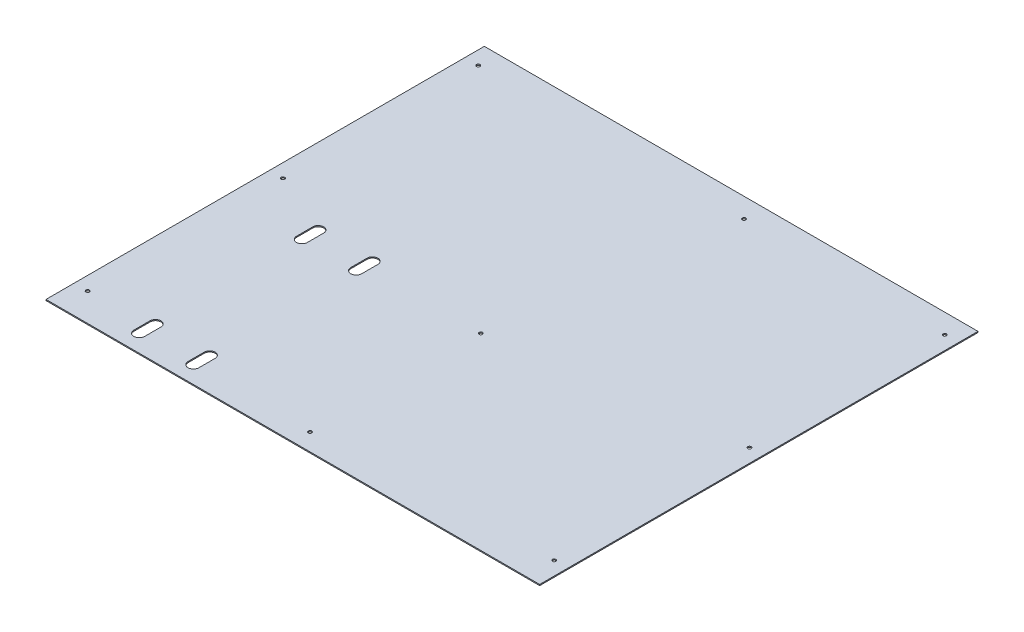
ISO-10303-21;
HEADER;
FILE_DESCRIPTION(('STEP AP214'),'2;1');
FILE_NAME('part.step','',(''),(''),'','','');
FILE_SCHEMA(('AUTOMOTIVE_DESIGN { 1 0 10303 214 1 1 1 1 }'));
ENDSEC;
DATA;
#1=APPLICATION_CONTEXT('core data for automotive mechanical design processes');
#2=APPLICATION_PROTOCOL_DEFINITION('international standard','automotive_design',2000,#1);
#3=PRODUCT_CONTEXT('',#1,'mechanical');
#4=PRODUCT('Part','Part','',(#3));
#5=PRODUCT_RELATED_PRODUCT_CATEGORY('part','',(#4));
#6=PRODUCT_DEFINITION_FORMATION('','',#4);
#7=PRODUCT_DEFINITION_CONTEXT('part definition',#1,'design');
#8=PRODUCT_DEFINITION('design','',#6,#7);
#9=PRODUCT_DEFINITION_SHAPE('','',#8);
#10=(LENGTH_UNIT() NAMED_UNIT(*) SI_UNIT(.MILLI.,.METRE.));
#11=(NAMED_UNIT(*) PLANE_ANGLE_UNIT() SI_UNIT($,.RADIAN.));
#12=(NAMED_UNIT(*) SI_UNIT($,.STERADIAN.) SOLID_ANGLE_UNIT());
#13=UNCERTAINTY_MEASURE_WITH_UNIT(LENGTH_MEASURE(1.E-05),#10,'distance_accuracy_value','');
#14=(GEOMETRIC_REPRESENTATION_CONTEXT(3) GLOBAL_UNCERTAINTY_ASSIGNED_CONTEXT((#13)) GLOBAL_UNIT_ASSIGNED_CONTEXT((#10,
#11,#12)) REPRESENTATION_CONTEXT('',''));
#15=CARTESIAN_POINT('',(0.,0.,0.));
#16=DIRECTION('',(0.,0.,1.));
#17=DIRECTION('',(1.,0.,0.));
#18=AXIS2_PLACEMENT_3D('',#15,#16,#17);
#19=CARTESIAN_POINT('',(227.5,1.,204.5));
#20=DIRECTION('',(-1.,0.,0.));
#21=DIRECTION('',(0.,0.,1.));
#22=AXIS2_PLACEMENT_3D('',#19,#20,#21);
#23=PLANE('',#22);
#24=DIRECTION('',(0.,0.,-1.));
#25=VECTOR('',#24,1.);
#26=CARTESIAN_POINT('',(227.5,0.,204.5));
#27=LINE('',#26,#25);
#28=CARTESIAN_POINT('',(227.5,0.,204.5));
#29=VERTEX_POINT('',#28);
#30=CARTESIAN_POINT('',(227.5,0.,-199.5));
#31=VERTEX_POINT('',#30);
#32=EDGE_CURVE('E405',#29,#31,#27,.T.);
#33=ORIENTED_EDGE('',*,*,#32,.T.);
#34=DIRECTION('',(0.,-1.,0.));
#35=VECTOR('',#34,1.);
#36=CARTESIAN_POINT('',(227.5,1.,-199.5));
#37=LINE('',#36,#35);
#38=CARTESIAN_POINT('',(227.5,1.,-199.5));
#39=VERTEX_POINT('',#38);
#40=EDGE_CURVE('E438',#39,#31,#37,.T.);
#41=ORIENTED_EDGE('',*,*,#40,.F.);
#42=DIRECTION('',(0.,0.,-1.));
#43=VECTOR('',#42,1.);
#44=CARTESIAN_POINT('',(227.5,1.,204.5));
#45=LINE('',#44,#43);
#46=CARTESIAN_POINT('',(227.5,1.,204.5));
#47=VERTEX_POINT('',#46);
#48=EDGE_CURVE('E406',#47,#39,#45,.T.);
#49=ORIENTED_EDGE('',*,*,#48,.F.);
#50=DIRECTION('',(0.,-1.,0.));
#51=VECTOR('',#50,1.);
#52=CARTESIAN_POINT('',(227.5,1.,204.5));
#53=LINE('',#52,#51);
#54=EDGE_CURVE('E418',#47,#29,#53,.T.);
#55=ORIENTED_EDGE('',*,*,#54,.T.);
#56=EDGE_LOOP('',(#33,#41,#49,#55));
#57=FACE_BOUND('',#56,.T.);
#58=ADVANCED_FACE('F40',(#57),#23,.F.);
#59=CARTESIAN_POINT('',(-227.5,1.,-199.5));
#60=DIRECTION('',(0.,0.,1.));
#61=DIRECTION('',(1.,0.,0.));
#62=AXIS2_PLACEMENT_3D('',#59,#60,#61);
#63=PLANE('',#62);
#64=DIRECTION('',(-1.,0.,0.));
#65=VECTOR('',#64,1.);
#66=CARTESIAN_POINT('',(-227.5,0.,-199.5));
#67=LINE('',#66,#65);
#68=CARTESIAN_POINT('',(-227.5,0.,-199.5));
#69=VERTEX_POINT('',#68);
#70=EDGE_CURVE('E422',#31,#69,#67,.T.);
#71=ORIENTED_EDGE('',*,*,#70,.T.);
#72=DIRECTION('',(0.,-1.,0.));
#73=VECTOR('',#72,1.);
#74=CARTESIAN_POINT('',(-227.5,1.,-199.5));
#75=LINE('',#74,#73);
#76=CARTESIAN_POINT('',(-227.5,1.,-199.5));
#77=VERTEX_POINT('',#76);
#78=EDGE_CURVE('E435',#77,#69,#75,.T.);
#79=ORIENTED_EDGE('',*,*,#78,.F.);
#80=DIRECTION('',(-1.,0.,0.));
#81=VECTOR('',#80,1.);
#82=CARTESIAN_POINT('',(-227.5,1.,-199.5));
#83=LINE('',#82,#81);
#84=EDGE_CURVE('E410',#39,#77,#83,.T.);
#85=ORIENTED_EDGE('',*,*,#84,.F.);
#86=ORIENTED_EDGE('',*,*,#40,.T.);
#87=EDGE_LOOP('',(#71,#79,#85,#86));
#88=FACE_BOUND('',#87,.T.);
#89=ADVANCED_FACE('F42',(#88),#63,.F.);
#90=CARTESIAN_POINT('',(-227.5,1.,204.5));
#91=DIRECTION('',(1.,0.,0.));
#92=DIRECTION('',(0.,0.,-1.));
#93=AXIS2_PLACEMENT_3D('',#90,#91,#92);
#94=PLANE('',#93);
#95=DIRECTION('',(0.,0.,1.));
#96=VECTOR('',#95,1.);
#97=CARTESIAN_POINT('',(-227.5,0.,204.5));
#98=LINE('',#97,#96);
#99=CARTESIAN_POINT('',(-227.5,0.,204.5));
#100=VERTEX_POINT('',#99);
#101=EDGE_CURVE('E423',#69,#100,#98,.T.);
#102=ORIENTED_EDGE('',*,*,#101,.T.);
#103=DIRECTION('',(0.,-1.,0.));
#104=VECTOR('',#103,1.);
#105=CARTESIAN_POINT('',(-227.5,1.,204.5));
#106=LINE('',#105,#104);
#107=CARTESIAN_POINT('',(-227.5,1.,204.5));
#108=VERTEX_POINT('',#107);
#109=EDGE_CURVE('E431',#108,#100,#106,.T.);
#110=ORIENTED_EDGE('',*,*,#109,.F.);
#111=DIRECTION('',(0.,0.,1.));
#112=VECTOR('',#111,1.);
#113=CARTESIAN_POINT('',(-227.5,1.,204.5));
#114=LINE('',#113,#112);
#115=EDGE_CURVE('E412',#77,#108,#114,.T.);
#116=ORIENTED_EDGE('',*,*,#115,.F.);
#117=ORIENTED_EDGE('',*,*,#78,.T.);
#118=EDGE_LOOP('',(#102,#110,#116,#117));
#119=FACE_BOUND('',#118,.T.);
#120=ADVANCED_FACE('F502',(#119),#94,.F.);
#121=CARTESIAN_POINT('',(-227.5,1.,204.5));
#122=DIRECTION('',(0.,0.,-1.));
#123=DIRECTION('',(-1.,0.,0.));
#124=AXIS2_PLACEMENT_3D('',#121,#122,#123);
#125=PLANE('',#124);
#126=DIRECTION('',(1.,0.,0.));
#127=VECTOR('',#126,1.);
#128=CARTESIAN_POINT('',(-227.5,0.,204.5));
#129=LINE('',#128,#127);
#130=EDGE_CURVE('E411',#100,#29,#129,.T.);
#131=ORIENTED_EDGE('',*,*,#130,.T.);
#132=ORIENTED_EDGE('',*,*,#54,.F.);
#133=DIRECTION('',(1.,0.,0.));
#134=VECTOR('',#133,1.);
#135=CARTESIAN_POINT('',(-227.5,1.,204.5));
#136=LINE('',#135,#134);
#137=EDGE_CURVE('E415',#108,#47,#136,.T.);
#138=ORIENTED_EDGE('',*,*,#137,.F.);
#139=ORIENTED_EDGE('',*,*,#109,.T.);
#140=EDGE_LOOP('',(#131,#132,#138,#139));
#141=FACE_BOUND('',#140,.T.);
#142=ADVANCED_FACE('F507',(#141),#125,.F.);
#143=CARTESIAN_POINT('',(0.,1.,0.));
#144=DIRECTION('',(0.,-1.,0.));
#145=DIRECTION('',(0.,0.,-1.));
#146=AXIS2_PLACEMENT_3D('',#143,#144,#145);
#147=PLANE('',#146);
#148=CARTESIAN_POINT('',(29.9999999999999,1.,-181.4));
#149=DIRECTION('',(0.,-1.,0.));
#150=DIRECTION('',(0.,0.,-1.));
#151=AXIS2_PLACEMENT_3D('',#148,#149,#150);
#152=CIRCLE('',#151,1.59999999999999);
#153=CARTESIAN_POINT('',(29.9999999999999,1.,-183.));
#154=VERTEX_POINT('',#153);
#155=EDGE_CURVE('E307',#154,#154,#152,.F.);
#156=ORIENTED_EDGE('',*,*,#155,.F.);
#157=EDGE_LOOP('',(#156));
#158=FACE_BOUND('',#157,.T.);
#159=CARTESIAN_POINT('',(0.,1.,188.6));
#160=DIRECTION('',(0.,-1.,0.));
#161=DIRECTION('',(0.,0.,-1.));
#162=AXIS2_PLACEMENT_3D('',#159,#160,#161);
#163=CIRCLE('',#162,1.59999999999999);
#164=CARTESIAN_POINT('',(0.,1.,187.));
#165=VERTEX_POINT('',#164);
#166=EDGE_CURVE('E315',#165,#165,#163,.F.);
#167=ORIENTED_EDGE('',*,*,#166,.F.);
#168=EDGE_LOOP('',(#167));
#169=FACE_BOUND('',#168,.T.);
#170=CARTESIAN_POINT('',(215.,1.,-1.39999999999992));
#171=DIRECTION('',(0.,-1.,0.));
#172=DIRECTION('',(0.,0.,-1.));
#173=AXIS2_PLACEMENT_3D('',#170,#171,#172);
#174=CIRCLE('',#173,1.59999999999999);
#175=CARTESIAN_POINT('',(215.,1.,-2.99999999999991));
#176=VERTEX_POINT('',#175);
#177=EDGE_CURVE('E323',#176,#176,#174,.F.);
#178=ORIENTED_EDGE('',*,*,#177,.F.);
#179=EDGE_LOOP('',(#178));
#180=FACE_BOUND('',#179,.T.);
#181=CARTESIAN_POINT('',(-215.,1.,-1.40000000000001));
#182=DIRECTION('',(0.,-1.,0.));
#183=DIRECTION('',(0.,0.,-1.));
#184=AXIS2_PLACEMENT_3D('',#181,#182,#183);
#185=CIRCLE('',#184,1.59999999999999);
#186=CARTESIAN_POINT('',(-215.,1.,-3.));
#187=VERTEX_POINT('',#186);
#188=EDGE_CURVE('E331',#187,#187,#185,.F.);
#189=ORIENTED_EDGE('',*,*,#188,.F.);
#190=EDGE_LOOP('',(#189));
#191=FACE_BOUND('',#190,.T.);
#192=CARTESIAN_POINT('',(-157.5,1.,188.6));
#193=DIRECTION('',(0.,-1.,0.));
#194=DIRECTION('',(0.,0.,-1.));
#195=AXIS2_PLACEMENT_3D('',#192,#193,#194);
#196=CIRCLE('',#195,4.99999999999999);
#197=CARTESIAN_POINT('',(-162.5,0.999999999999999,188.6));
#198=VERTEX_POINT('',#197);
#199=CARTESIAN_POINT('',(-152.5,0.999999999999999,188.6));
#200=VERTEX_POINT('',#199);
#201=EDGE_CURVE('E339',#198,#200,#196,.F.);
#202=ORIENTED_EDGE('',*,*,#201,.F.);
#203=DIRECTION('',(0.,0.,-1.));
#204=VECTOR('',#203,1.);
#205=CARTESIAN_POINT('',(-162.5,1.,0.));
#206=LINE('',#205,#204);
#207=CARTESIAN_POINT('',(-162.5,0.999999999999999,173.6));
#208=VERTEX_POINT('',#207);
#209=EDGE_CURVE('E262',#198,#208,#206,.T.);
#210=ORIENTED_EDGE('',*,*,#209,.T.);
#211=CARTESIAN_POINT('',(-157.5,0.999999999999999,173.6));
#212=DIRECTION('',(0.,-1.,0.));
#213=DIRECTION('',(0.,0.,-1.));
#214=AXIS2_PLACEMENT_3D('',#211,#212,#213);
#215=CIRCLE('',#214,5.);
#216=CARTESIAN_POINT('',(-152.5,0.999999999999999,173.6));
#217=VERTEX_POINT('',#216);
#218=EDGE_CURVE('E288',#208,#217,#215,.T.);
#219=ORIENTED_EDGE('',*,*,#218,.T.);
#220=DIRECTION('',(0.,0.,1.));
#221=VECTOR('',#220,1.);
#222=CARTESIAN_POINT('',(-152.5,1.,0.));
#223=LINE('',#222,#221);
#224=EDGE_CURVE('E256',#217,#200,#223,.T.);
#225=ORIENTED_EDGE('',*,*,#224,.T.);
#226=EDGE_LOOP('',(#202,#210,#219,#225));
#227=FACE_BOUND('',#226,.T.);
#228=CARTESIAN_POINT('',(-107.5,1.,188.6));
#229=DIRECTION('',(0.,-1.,0.));
#230=DIRECTION('',(0.,0.,-1.));
#231=AXIS2_PLACEMENT_3D('',#228,#229,#230);
#232=CIRCLE('',#231,5.00000000000001);
#233=CARTESIAN_POINT('',(-112.5,0.999999999999999,188.6));
#234=VERTEX_POINT('',#233);
#235=CARTESIAN_POINT('',(-102.5,0.999999999999999,188.6));
#236=VERTEX_POINT('',#235);
#237=EDGE_CURVE('E347',#234,#236,#232,.F.);
#238=ORIENTED_EDGE('',*,*,#237,.F.);
#239=DIRECTION('',(0.,0.,-1.));
#240=VECTOR('',#239,1.);
#241=CARTESIAN_POINT('',(-112.5,1.,0.));
#242=LINE('',#241,#240);
#243=CARTESIAN_POINT('',(-112.5,0.999999999999999,173.6));
#244=VERTEX_POINT('',#243);
#245=EDGE_CURVE('E270',#234,#244,#242,.T.);
#246=ORIENTED_EDGE('',*,*,#245,.T.);
#247=CARTESIAN_POINT('',(-107.5,0.999999999999999,173.6));
#248=DIRECTION('',(0.,-1.,0.));
#249=DIRECTION('',(0.,0.,-1.));
#250=AXIS2_PLACEMENT_3D('',#247,#248,#249);
#251=CIRCLE('',#250,5.);
#252=CARTESIAN_POINT('',(-102.5,0.999999999999999,173.6));
#253=VERTEX_POINT('',#252);
#254=EDGE_CURVE('E299',#244,#253,#251,.T.);
#255=ORIENTED_EDGE('',*,*,#254,.T.);
#256=DIRECTION('',(0.,0.,1.));
#257=VECTOR('',#256,1.);
#258=CARTESIAN_POINT('',(-102.5,1.,0.));
#259=LINE('',#258,#257);
#260=EDGE_CURVE('E266',#253,#236,#259,.T.);
#261=ORIENTED_EDGE('',*,*,#260,.T.);
#262=EDGE_LOOP('',(#238,#246,#255,#261));
#263=FACE_BOUND('',#262,.T.);
#264=CARTESIAN_POINT('',(-107.5,1.,38.6));
#265=DIRECTION('',(0.,-1.,0.));
#266=DIRECTION('',(0.,0.,-1.));
#267=AXIS2_PLACEMENT_3D('',#264,#265,#266);
#268=CIRCLE('',#267,5.00000000000001);
#269=CARTESIAN_POINT('',(-112.5,0.999999999999999,38.6));
#270=VERTEX_POINT('',#269);
#271=CARTESIAN_POINT('',(-102.5,0.999999999999999,38.6));
#272=VERTEX_POINT('',#271);
#273=EDGE_CURVE('E353',#270,#272,#268,.F.);
#274=ORIENTED_EDGE('',*,*,#273,.F.);
#275=DIRECTION('',(0.,0.,-1.));
#276=VECTOR('',#275,1.);
#277=CARTESIAN_POINT('',(-112.5,1.,0.));
#278=LINE('',#277,#276);
#279=CARTESIAN_POINT('',(-112.5,0.999999999999999,23.6));
#280=VERTEX_POINT('',#279);
#281=EDGE_CURVE('E276',#270,#280,#278,.T.);
#282=ORIENTED_EDGE('',*,*,#281,.T.);
#283=CARTESIAN_POINT('',(-107.5,0.999999999999999,23.6));
#284=DIRECTION('',(0.,-1.,0.));
#285=DIRECTION('',(0.,0.,-1.));
#286=AXIS2_PLACEMENT_3D('',#283,#284,#285);
#287=CIRCLE('',#286,5.);
#288=CARTESIAN_POINT('',(-102.5,0.999999999999999,23.6));
#289=VERTEX_POINT('',#288);
#290=EDGE_CURVE('E292',#280,#289,#287,.T.);
#291=ORIENTED_EDGE('',*,*,#290,.T.);
#292=DIRECTION('',(0.,0.,1.));
#293=VECTOR('',#292,1.);
#294=CARTESIAN_POINT('',(-102.5,1.,0.));
#295=LINE('',#294,#293);
#296=EDGE_CURVE('E180',#289,#272,#295,.T.);
#297=ORIENTED_EDGE('',*,*,#296,.T.);
#298=EDGE_LOOP('',(#274,#282,#291,#297));
#299=FACE_BOUND('',#298,.T.);
#300=CARTESIAN_POINT('',(-157.5,1.,38.6));
#301=DIRECTION('',(0.,-1.,0.));
#302=DIRECTION('',(0.,0.,-1.));
#303=AXIS2_PLACEMENT_3D('',#300,#301,#302);
#304=CIRCLE('',#303,4.99999999999999);
#305=CARTESIAN_POINT('',(-162.5,0.999999999999999,38.6));
#306=VERTEX_POINT('',#305);
#307=CARTESIAN_POINT('',(-152.5,0.999999999999999,38.6));
#308=VERTEX_POINT('',#307);
#309=EDGE_CURVE('E361',#306,#308,#304,.F.);
#310=ORIENTED_EDGE('',*,*,#309,.F.);
#311=DIRECTION('',(0.,0.,-1.));
#312=VECTOR('',#311,1.);
#313=CARTESIAN_POINT('',(-162.5,1.,0.));
#314=LINE('',#313,#312);
#315=CARTESIAN_POINT('',(-162.5,0.999999999999999,23.6));
#316=VERTEX_POINT('',#315);
#317=EDGE_CURVE('E284',#306,#316,#314,.T.);
#318=ORIENTED_EDGE('',*,*,#317,.T.);
#319=CARTESIAN_POINT('',(-157.5,0.999999999999999,23.6));
#320=DIRECTION('',(0.,-1.,0.));
#321=DIRECTION('',(0.,0.,-1.));
#322=AXIS2_PLACEMENT_3D('',#319,#320,#321);
#323=CIRCLE('',#322,5.);
#324=CARTESIAN_POINT('',(-152.5,0.999999999999999,23.6));
#325=VERTEX_POINT('',#324);
#326=EDGE_CURVE('E295',#316,#325,#323,.T.);
#327=ORIENTED_EDGE('',*,*,#326,.T.);
#328=DIRECTION('',(0.,0.,1.));
#329=VECTOR('',#328,1.);
#330=CARTESIAN_POINT('',(-152.5,1.,0.));
#331=LINE('',#330,#329);
#332=EDGE_CURVE('E280',#325,#308,#331,.T.);
#333=ORIENTED_EDGE('',*,*,#332,.T.);
#334=EDGE_LOOP('',(#310,#318,#327,#333));
#335=FACE_BOUND('',#334,.T.);
#336=CARTESIAN_POINT('',(0.,1.,31.25));
#337=DIRECTION('',(0.,-1.,0.));
#338=DIRECTION('',(0.,0.,-1.));
#339=AXIS2_PLACEMENT_3D('',#336,#337,#338);
#340=CIRCLE('',#339,1.6);
#341=CARTESIAN_POINT('',(0.,1.,29.65));
#342=VERTEX_POINT('',#341);
#343=EDGE_CURVE('E369',#342,#342,#340,.F.);
#344=ORIENTED_EDGE('',*,*,#343,.F.);
#345=EDGE_LOOP('',(#344));
#346=FACE_BOUND('',#345,.T.);
#347=CARTESIAN_POINT('',(215.,1.,178.6));
#348=DIRECTION('',(0.,-1.,0.));
#349=DIRECTION('',(0.,0.,-1.));
#350=AXIS2_PLACEMENT_3D('',#347,#348,#349);
#351=CIRCLE('',#350,1.59999999999999);
#352=CARTESIAN_POINT('',(215.,1.,177.));
#353=VERTEX_POINT('',#352);
#354=EDGE_CURVE('E377',#353,#353,#351,.F.);
#355=ORIENTED_EDGE('',*,*,#354,.F.);
#356=EDGE_LOOP('',(#355));
#357=FACE_BOUND('',#356,.T.);
#358=CARTESIAN_POINT('',(215.,1.,-181.4));
#359=DIRECTION('',(0.,-1.,0.));
#360=DIRECTION('',(0.,0.,-1.));
#361=AXIS2_PLACEMENT_3D('',#358,#359,#360);
#362=CIRCLE('',#361,1.59999999999999);
#363=CARTESIAN_POINT('',(215.,1.,-183.));
#364=VERTEX_POINT('',#363);
#365=EDGE_CURVE('E385',#364,#364,#362,.F.);
#366=ORIENTED_EDGE('',*,*,#365,.F.);
#367=EDGE_LOOP('',(#366));
#368=FACE_BOUND('',#367,.T.);
#369=CARTESIAN_POINT('',(-215.,1.,-181.4));
#370=DIRECTION('',(0.,-1.,0.));
#371=DIRECTION('',(0.,0.,-1.));
#372=AXIS2_PLACEMENT_3D('',#369,#370,#371);
#373=CIRCLE('',#372,1.59999999999999);
#374=CARTESIAN_POINT('',(-215.,1.,-183.));
#375=VERTEX_POINT('',#374);
#376=EDGE_CURVE('E393',#375,#375,#373,.F.);
#377=ORIENTED_EDGE('',*,*,#376,.F.);
#378=EDGE_LOOP('',(#377));
#379=FACE_BOUND('',#378,.T.);
#380=CARTESIAN_POINT('',(-215.,1.,178.6));
#381=DIRECTION('',(0.,-1.,0.));
#382=DIRECTION('',(0.,0.,-1.));
#383=AXIS2_PLACEMENT_3D('',#380,#381,#382);
#384=CIRCLE('',#383,1.59999999999999);
#385=CARTESIAN_POINT('',(-215.,1.,177.));
#386=VERTEX_POINT('',#385);
#387=EDGE_CURVE('E401',#386,#386,#384,.F.);
#388=ORIENTED_EDGE('',*,*,#387,.F.);
#389=EDGE_LOOP('',(#388));
#390=FACE_BOUND('',#389,.T.);
#391=ORIENTED_EDGE('',*,*,#48,.T.);
#392=ORIENTED_EDGE('',*,*,#84,.T.);
#393=ORIENTED_EDGE('',*,*,#115,.T.);
#394=ORIENTED_EDGE('',*,*,#137,.T.);
#395=EDGE_LOOP('',(#391,#392,#393,#394));
#396=FACE_BOUND('',#395,.T.);
#397=ADVANCED_FACE('F474',(#158,#169,#180,#191,#227,#263,#299,#335,#346,#357,#368,#379,#390,
#396),#147,.F.);
#398=CARTESIAN_POINT('',(0.,0.,0.));
#399=DIRECTION('',(0.,-1.,0.));
#400=DIRECTION('',(0.,0.,-1.));
#401=AXIS2_PLACEMENT_3D('',#398,#399,#400);
#402=PLANE('',#401);
#403=DIRECTION('',(0.,0.,-1.));
#404=VECTOR('',#403,1.);
#405=CARTESIAN_POINT('',(-112.5,0.,173.6));
#406=LINE('',#405,#404);
#407=CARTESIAN_POINT('',(-112.5,0.,188.6));
#408=VERTEX_POINT('',#407);
#409=CARTESIAN_POINT('',(-112.5,0.,173.6));
#410=VERTEX_POINT('',#409);
#411=EDGE_CURVE('E217',#408,#410,#406,.T.);
#412=ORIENTED_EDGE('',*,*,#411,.F.);
#413=CARTESIAN_POINT('',(-107.5,0.,188.6));
#414=DIRECTION('',(0.,-1.,0.));
#415=DIRECTION('',(0.,0.,-1.));
#416=AXIS2_PLACEMENT_3D('',#413,#414,#415);
#417=CIRCLE('',#416,5.00000000000001);
#418=CARTESIAN_POINT('',(-102.5,0.,188.6));
#419=VERTEX_POINT('',#418);
#420=EDGE_CURVE('E343',#419,#408,#417,.T.);
#421=ORIENTED_EDGE('',*,*,#420,.F.);
#422=DIRECTION('',(0.,0.,1.));
#423=VECTOR('',#422,1.);
#424=CARTESIAN_POINT('',(-102.5,0.,173.6));
#425=LINE('',#424,#423);
#426=CARTESIAN_POINT('',(-102.5,0.,173.6));
#427=VERTEX_POINT('',#426);
#428=EDGE_CURVE('E213',#427,#419,#425,.T.);
#429=ORIENTED_EDGE('',*,*,#428,.F.);
#430=CARTESIAN_POINT('',(-107.5,0.,173.6));
#431=DIRECTION('',(0.,-1.,0.));
#432=DIRECTION('',(0.,0.,-1.));
#433=AXIS2_PLACEMENT_3D('',#430,#431,#432);
#434=CIRCLE('',#433,5.);
#435=EDGE_CURVE('E209',#410,#427,#434,.T.);
#436=ORIENTED_EDGE('',*,*,#435,.F.);
#437=EDGE_LOOP('',(#412,#421,#429,#436));
#438=FACE_BOUND('',#437,.T.);
#439=DIRECTION('',(0.,0.,-1.));
#440=VECTOR('',#439,1.);
#441=CARTESIAN_POINT('',(-162.5,0.,23.6));
#442=LINE('',#441,#440);
#443=CARTESIAN_POINT('',(-162.5,0.,38.6));
#444=VERTEX_POINT('',#443);
#445=CARTESIAN_POINT('',(-162.5,0.,23.6));
#446=VERTEX_POINT('',#445);
#447=EDGE_CURVE('E233',#444,#446,#442,.T.);
#448=ORIENTED_EDGE('',*,*,#447,.F.);
#449=CARTESIAN_POINT('',(-157.5,0.,38.6));
#450=DIRECTION('',(0.,-1.,0.));
#451=DIRECTION('',(0.,0.,-1.));
#452=AXIS2_PLACEMENT_3D('',#449,#450,#451);
#453=CIRCLE('',#452,4.99999999999999);
#454=CARTESIAN_POINT('',(-152.5,0.,38.6));
#455=VERTEX_POINT('',#454);
#456=EDGE_CURVE('E357',#455,#444,#453,.T.);
#457=ORIENTED_EDGE('',*,*,#456,.F.);
#458=DIRECTION('',(0.,0.,1.));
#459=VECTOR('',#458,1.);
#460=CARTESIAN_POINT('',(-152.5,0.,23.6));
#461=LINE('',#460,#459);
#462=CARTESIAN_POINT('',(-152.5,0.,23.6));
#463=VERTEX_POINT('',#462);
#464=EDGE_CURVE('E56',#463,#455,#461,.T.);
#465=ORIENTED_EDGE('',*,*,#464,.F.);
#466=CARTESIAN_POINT('',(-157.5,0.,23.6));
#467=DIRECTION('',(0.,-1.,0.));
#468=DIRECTION('',(0.,0.,-1.));
#469=AXIS2_PLACEMENT_3D('',#466,#467,#468);
#470=CIRCLE('',#469,5.);
#471=EDGE_CURVE('E207',#446,#463,#470,.T.);
#472=ORIENTED_EDGE('',*,*,#471,.F.);
#473=EDGE_LOOP('',(#448,#457,#465,#472));
#474=FACE_BOUND('',#473,.T.);
#475=DIRECTION('',(0.,0.,-1.));
#476=VECTOR('',#475,1.);
#477=CARTESIAN_POINT('',(-112.5,0.,23.6));
#478=LINE('',#477,#476);
#479=CARTESIAN_POINT('',(-112.5,0.,38.6));
#480=VERTEX_POINT('',#479);
#481=CARTESIAN_POINT('',(-112.5,0.,23.6));
#482=VERTEX_POINT('',#481);
#483=EDGE_CURVE('E185',#480,#482,#478,.T.);
#484=ORIENTED_EDGE('',*,*,#483,.F.);
#485=CARTESIAN_POINT('',(-107.5,0.,38.6));
#486=DIRECTION('',(0.,-1.,0.));
#487=DIRECTION('',(0.,0.,-1.));
#488=AXIS2_PLACEMENT_3D('',#485,#486,#487);
#489=CIRCLE('',#488,5.00000000000001);
#490=CARTESIAN_POINT('',(-102.5,0.,38.6));
#491=VERTEX_POINT('',#490);
#492=EDGE_CURVE('E200',#491,#480,#489,.T.);
#493=ORIENTED_EDGE('',*,*,#492,.F.);
#494=DIRECTION('',(0.,0.,1.));
#495=VECTOR('',#494,1.);
#496=CARTESIAN_POINT('',(-102.5,0.,23.6));
#497=LINE('',#496,#495);
#498=CARTESIAN_POINT('',(-102.5,0.,23.6));
#499=VERTEX_POINT('',#498);
#500=EDGE_CURVE('E64',#499,#491,#497,.T.);
#501=ORIENTED_EDGE('',*,*,#500,.F.);
#502=CARTESIAN_POINT('',(-107.5,0.,23.6));
#503=DIRECTION('',(0.,-1.,0.));
#504=DIRECTION('',(0.,0.,-1.));
#505=AXIS2_PLACEMENT_3D('',#502,#503,#504);
#506=CIRCLE('',#505,5.);
#507=EDGE_CURVE('E188',#482,#499,#506,.T.);
#508=ORIENTED_EDGE('',*,*,#507,.F.);
#509=EDGE_LOOP('',(#484,#493,#501,#508));
#510=FACE_BOUND('',#509,.T.);
#511=DIRECTION('',(0.,0.,-1.));
#512=VECTOR('',#511,1.);
#513=CARTESIAN_POINT('',(-162.5,0.,173.6));
#514=LINE('',#513,#512);
#515=CARTESIAN_POINT('',(-162.5,0.,188.6));
#516=VERTEX_POINT('',#515);
#517=CARTESIAN_POINT('',(-162.5,0.,173.6));
#518=VERTEX_POINT('',#517);
#519=EDGE_CURVE('E248',#516,#518,#514,.T.);
#520=ORIENTED_EDGE('',*,*,#519,.F.);
#521=CARTESIAN_POINT('',(-157.5,0.,188.6));
#522=DIRECTION('',(0.,-1.,0.));
#523=DIRECTION('',(0.,0.,-1.));
#524=AXIS2_PLACEMENT_3D('',#521,#522,#523);
#525=CIRCLE('',#524,4.99999999999999);
#526=CARTESIAN_POINT('',(-152.5,0.,188.6));
#527=VERTEX_POINT('',#526);
#528=EDGE_CURVE('E335',#527,#516,#525,.T.);
#529=ORIENTED_EDGE('',*,*,#528,.F.);
#530=DIRECTION('',(0.,0.,1.));
#531=VECTOR('',#530,1.);
#532=CARTESIAN_POINT('',(-152.5,0.,173.6));
#533=LINE('',#532,#531);
#534=CARTESIAN_POINT('',(-152.5,0.,173.6));
#535=VERTEX_POINT('',#534);
#536=EDGE_CURVE('E245',#535,#527,#533,.T.);
#537=ORIENTED_EDGE('',*,*,#536,.F.);
#538=CARTESIAN_POINT('',(-157.5,0.,173.6));
#539=DIRECTION('',(0.,-1.,0.));
#540=DIRECTION('',(0.,0.,-1.));
#541=AXIS2_PLACEMENT_3D('',#538,#539,#540);
#542=CIRCLE('',#541,5.);
#543=EDGE_CURVE('E225',#518,#535,#542,.T.);
#544=ORIENTED_EDGE('',*,*,#543,.F.);
#545=EDGE_LOOP('',(#520,#529,#537,#544));
#546=FACE_BOUND('',#545,.T.);
#547=CARTESIAN_POINT('',(29.9999999999999,0.,-181.4));
#548=DIRECTION('',(0.,-1.,0.));
#549=DIRECTION('',(0.,0.,-1.));
#550=AXIS2_PLACEMENT_3D('',#547,#548,#549);
#551=CIRCLE('',#550,1.59999999999999);
#552=CARTESIAN_POINT('',(29.9999999999999,0.,-183.));
#553=VERTEX_POINT('',#552);
#554=EDGE_CURVE('E303',#553,#553,#551,.T.);
#555=ORIENTED_EDGE('',*,*,#554,.F.);
#556=EDGE_LOOP('',(#555));
#557=FACE_BOUND('',#556,.T.);
#558=CARTESIAN_POINT('',(0.,0.,188.6));
#559=DIRECTION('',(0.,-1.,0.));
#560=DIRECTION('',(0.,0.,-1.));
#561=AXIS2_PLACEMENT_3D('',#558,#559,#560);
#562=CIRCLE('',#561,1.59999999999999);
#563=CARTESIAN_POINT('',(0.,0.,187.));
#564=VERTEX_POINT('',#563);
#565=EDGE_CURVE('E311',#564,#564,#562,.T.);
#566=ORIENTED_EDGE('',*,*,#565,.F.);
#567=EDGE_LOOP('',(#566));
#568=FACE_BOUND('',#567,.T.);
#569=CARTESIAN_POINT('',(215.,0.,-1.39999999999992));
#570=DIRECTION('',(0.,-1.,0.));
#571=DIRECTION('',(0.,0.,-1.));
#572=AXIS2_PLACEMENT_3D('',#569,#570,#571);
#573=CIRCLE('',#572,1.59999999999999);
#574=CARTESIAN_POINT('',(215.,0.,-2.99999999999991));
#575=VERTEX_POINT('',#574);
#576=EDGE_CURVE('E319',#575,#575,#573,.T.);
#577=ORIENTED_EDGE('',*,*,#576,.F.);
#578=EDGE_LOOP('',(#577));
#579=FACE_BOUND('',#578,.T.);
#580=CARTESIAN_POINT('',(-215.,0.,-1.40000000000001));
#581=DIRECTION('',(0.,-1.,0.));
#582=DIRECTION('',(0.,0.,-1.));
#583=AXIS2_PLACEMENT_3D('',#580,#581,#582);
#584=CIRCLE('',#583,1.59999999999999);
#585=CARTESIAN_POINT('',(-215.,0.,-3.));
#586=VERTEX_POINT('',#585);
#587=EDGE_CURVE('E327',#586,#586,#584,.T.);
#588=ORIENTED_EDGE('',*,*,#587,.F.);
#589=EDGE_LOOP('',(#588));
#590=FACE_BOUND('',#589,.T.);
#591=CARTESIAN_POINT('',(0.,0.,31.25));
#592=DIRECTION('',(0.,-1.,0.));
#593=DIRECTION('',(0.,0.,-1.));
#594=AXIS2_PLACEMENT_3D('',#591,#592,#593);
#595=CIRCLE('',#594,1.6);
#596=CARTESIAN_POINT('',(0.,0.,29.65));
#597=VERTEX_POINT('',#596);
#598=EDGE_CURVE('E365',#597,#597,#595,.T.);
#599=ORIENTED_EDGE('',*,*,#598,.F.);
#600=EDGE_LOOP('',(#599));
#601=FACE_BOUND('',#600,.T.);
#602=CARTESIAN_POINT('',(215.,0.,178.6));
#603=DIRECTION('',(0.,-1.,0.));
#604=DIRECTION('',(0.,0.,-1.));
#605=AXIS2_PLACEMENT_3D('',#602,#603,#604);
#606=CIRCLE('',#605,1.59999999999999);
#607=CARTESIAN_POINT('',(215.,0.,177.));
#608=VERTEX_POINT('',#607);
#609=EDGE_CURVE('E373',#608,#608,#606,.T.);
#610=ORIENTED_EDGE('',*,*,#609,.F.);
#611=EDGE_LOOP('',(#610));
#612=FACE_BOUND('',#611,.T.);
#613=CARTESIAN_POINT('',(215.,0.,-181.4));
#614=DIRECTION('',(0.,-1.,0.));
#615=DIRECTION('',(0.,0.,-1.));
#616=AXIS2_PLACEMENT_3D('',#613,#614,#615);
#617=CIRCLE('',#616,1.59999999999999);
#618=CARTESIAN_POINT('',(215.,0.,-183.));
#619=VERTEX_POINT('',#618);
#620=EDGE_CURVE('E381',#619,#619,#617,.T.);
#621=ORIENTED_EDGE('',*,*,#620,.F.);
#622=EDGE_LOOP('',(#621));
#623=FACE_BOUND('',#622,.T.);
#624=CARTESIAN_POINT('',(-215.,0.,-181.4));
#625=DIRECTION('',(0.,-1.,0.));
#626=DIRECTION('',(0.,0.,-1.));
#627=AXIS2_PLACEMENT_3D('',#624,#625,#626);
#628=CIRCLE('',#627,1.59999999999999);
#629=CARTESIAN_POINT('',(-215.,0.,-183.));
#630=VERTEX_POINT('',#629);
#631=EDGE_CURVE('E389',#630,#630,#628,.T.);
#632=ORIENTED_EDGE('',*,*,#631,.F.);
#633=EDGE_LOOP('',(#632));
#634=FACE_BOUND('',#633,.T.);
#635=CARTESIAN_POINT('',(-215.,0.,178.6));
#636=DIRECTION('',(0.,-1.,0.));
#637=DIRECTION('',(0.,0.,-1.));
#638=AXIS2_PLACEMENT_3D('',#635,#636,#637);
#639=CIRCLE('',#638,1.59999999999999);
#640=CARTESIAN_POINT('',(-215.,0.,177.));
#641=VERTEX_POINT('',#640);
#642=EDGE_CURVE('E397',#641,#641,#639,.T.);
#643=ORIENTED_EDGE('',*,*,#642,.F.);
#644=EDGE_LOOP('',(#643));
#645=FACE_BOUND('',#644,.T.);
#646=ORIENTED_EDGE('',*,*,#32,.F.);
#647=ORIENTED_EDGE('',*,*,#130,.F.);
#648=ORIENTED_EDGE('',*,*,#101,.F.);
#649=ORIENTED_EDGE('',*,*,#70,.F.);
#650=EDGE_LOOP('',(#646,#647,#648,#649));
#651=FACE_BOUND('',#650,.T.);
#652=ADVANCED_FACE('F197',(#438,#474,#510,#546,#557,#568,#579,#590,#601,#612,#623,#634,#645,
#651),#402,.T.);
#653=CARTESIAN_POINT('',(-215.,1.001,178.6));
#654=DIRECTION('',(0.,-1.,0.));
#655=DIRECTION('',(0.,0.,-1.));
#656=AXIS2_PLACEMENT_3D('',#653,#654,#655);
#657=CYLINDRICAL_SURFACE('',#656,1.59999999999999);
#658=ORIENTED_EDGE('',*,*,#642,.T.);
#659=EDGE_LOOP('',(#658));
#660=FACE_BOUND('',#659,.T.);
#661=ORIENTED_EDGE('',*,*,#387,.T.);
#662=EDGE_LOOP('',(#661));
#663=FACE_BOUND('',#662,.T.);
#664=ADVANCED_FACE('F514',(#660,#663),#657,.F.);
#665=CARTESIAN_POINT('',(-215.,1.001,-181.4));
#666=DIRECTION('',(0.,-1.,0.));
#667=DIRECTION('',(0.,0.,-1.));
#668=AXIS2_PLACEMENT_3D('',#665,#666,#667);
#669=CYLINDRICAL_SURFACE('',#668,1.59999999999999);
#670=ORIENTED_EDGE('',*,*,#631,.T.);
#671=EDGE_LOOP('',(#670));
#672=FACE_BOUND('',#671,.T.);
#673=ORIENTED_EDGE('',*,*,#376,.T.);
#674=EDGE_LOOP('',(#673));
#675=FACE_BOUND('',#674,.T.);
#676=ADVANCED_FACE('F521',(#672,#675),#669,.F.);
#677=CARTESIAN_POINT('',(215.,1.001,-181.4));
#678=DIRECTION('',(0.,-1.,0.));
#679=DIRECTION('',(0.,0.,-1.));
#680=AXIS2_PLACEMENT_3D('',#677,#678,#679);
#681=CYLINDRICAL_SURFACE('',#680,1.59999999999999);
#682=ORIENTED_EDGE('',*,*,#620,.T.);
#683=EDGE_LOOP('',(#682));
#684=FACE_BOUND('',#683,.T.);
#685=ORIENTED_EDGE('',*,*,#365,.T.);
#686=EDGE_LOOP('',(#685));
#687=FACE_BOUND('',#686,.T.);
#688=ADVANCED_FACE('F525',(#684,#687),#681,.F.);
#689=CARTESIAN_POINT('',(215.,1.001,178.6));
#690=DIRECTION('',(0.,-1.,0.));
#691=DIRECTION('',(0.,0.,-1.));
#692=AXIS2_PLACEMENT_3D('',#689,#690,#691);
#693=CYLINDRICAL_SURFACE('',#692,1.59999999999999);
#694=ORIENTED_EDGE('',*,*,#609,.T.);
#695=EDGE_LOOP('',(#694));
#696=FACE_BOUND('',#695,.T.);
#697=ORIENTED_EDGE('',*,*,#354,.T.);
#698=EDGE_LOOP('',(#697));
#699=FACE_BOUND('',#698,.T.);
#700=ADVANCED_FACE('F529',(#696,#699),#693,.F.);
#701=CARTESIAN_POINT('',(0.,1.001,31.25));
#702=DIRECTION('',(0.,-1.,0.));
#703=DIRECTION('',(0.,0.,-1.));
#704=AXIS2_PLACEMENT_3D('',#701,#702,#703);
#705=CYLINDRICAL_SURFACE('',#704,1.6);
#706=ORIENTED_EDGE('',*,*,#598,.T.);
#707=EDGE_LOOP('',(#706));
#708=FACE_BOUND('',#707,.T.);
#709=ORIENTED_EDGE('',*,*,#343,.T.);
#710=EDGE_LOOP('',(#709));
#711=FACE_BOUND('',#710,.T.);
#712=ADVANCED_FACE('F533',(#708,#711),#705,.F.);
#713=CARTESIAN_POINT('',(-157.5,1.001,38.6));
#714=DIRECTION('',(0.,-1.,0.));
#715=DIRECTION('',(0.,0.,-1.));
#716=AXIS2_PLACEMENT_3D('',#713,#714,#715);
#717=CYLINDRICAL_SURFACE('',#716,4.99999999999999);
#718=ORIENTED_EDGE('',*,*,#456,.T.);
#719=DIRECTION('',(0.,-1.,0.));
#720=VECTOR('',#719,1.);
#721=CARTESIAN_POINT('',(-162.5,1.001,38.6));
#722=LINE('',#721,#720);
#723=EDGE_CURVE('E12',#444,#306,#722,.F.);
#724=ORIENTED_EDGE('',*,*,#723,.T.);
#725=ORIENTED_EDGE('',*,*,#309,.T.);
#726=DIRECTION('',(0.,-1.,0.));
#727=VECTOR('',#726,1.);
#728=CARTESIAN_POINT('',(-152.5,1.001,38.6));
#729=LINE('',#728,#727);
#730=EDGE_CURVE('E49',#455,#308,#729,.F.);
#731=ORIENTED_EDGE('',*,*,#730,.F.);
#732=EDGE_LOOP('',(#718,#724,#725,#731));
#733=FACE_BOUND('',#732,.T.);
#734=ADVANCED_FACE('F476',(#733),#717,.F.);
#735=CARTESIAN_POINT('',(-107.5,1.001,38.6));
#736=DIRECTION('',(0.,-1.,0.));
#737=DIRECTION('',(0.,0.,-1.));
#738=AXIS2_PLACEMENT_3D('',#735,#736,#737);
#739=CYLINDRICAL_SURFACE('',#738,5.00000000000001);
#740=ORIENTED_EDGE('',*,*,#492,.T.);
#741=DIRECTION('',(0.,-1.,0.));
#742=VECTOR('',#741,1.);
#743=CARTESIAN_POINT('',(-112.5,1.001,38.6));
#744=LINE('',#743,#742);
#745=EDGE_CURVE('E464',#480,#270,#744,.F.);
#746=ORIENTED_EDGE('',*,*,#745,.T.);
#747=ORIENTED_EDGE('',*,*,#273,.T.);
#748=DIRECTION('',(0.,-1.,0.));
#749=VECTOR('',#748,1.);
#750=CARTESIAN_POINT('',(-102.5,1.001,38.6));
#751=LINE('',#750,#749);
#752=EDGE_CURVE('E461',#491,#272,#751,.F.);
#753=ORIENTED_EDGE('',*,*,#752,.F.);
#754=EDGE_LOOP('',(#740,#746,#747,#753));
#755=FACE_BOUND('',#754,.T.);
#756=ADVANCED_FACE('F540',(#755),#739,.F.);
#757=CARTESIAN_POINT('',(-107.5,1.001,188.6));
#758=DIRECTION('',(0.,-1.,0.));
#759=DIRECTION('',(0.,0.,-1.));
#760=AXIS2_PLACEMENT_3D('',#757,#758,#759);
#761=CYLINDRICAL_SURFACE('',#760,5.00000000000001);
#762=ORIENTED_EDGE('',*,*,#420,.T.);
#763=DIRECTION('',(0.,-1.,0.));
#764=VECTOR('',#763,1.);
#765=CARTESIAN_POINT('',(-112.5,1.001,188.6));
#766=LINE('',#765,#764);
#767=EDGE_CURVE('E457',#408,#234,#766,.F.);
#768=ORIENTED_EDGE('',*,*,#767,.T.);
#769=ORIENTED_EDGE('',*,*,#237,.T.);
#770=DIRECTION('',(0.,-1.,0.));
#771=VECTOR('',#770,1.);
#772=CARTESIAN_POINT('',(-102.5,1.001,188.6));
#773=LINE('',#772,#771);
#774=EDGE_CURVE('E454',#419,#236,#773,.F.);
#775=ORIENTED_EDGE('',*,*,#774,.F.);
#776=EDGE_LOOP('',(#762,#768,#769,#775));
#777=FACE_BOUND('',#776,.T.);
#778=ADVANCED_FACE('F543',(#777),#761,.F.);
#779=CARTESIAN_POINT('',(-157.5,1.001,188.6));
#780=DIRECTION('',(0.,-1.,0.));
#781=DIRECTION('',(0.,0.,-1.));
#782=AXIS2_PLACEMENT_3D('',#779,#780,#781);
#783=CYLINDRICAL_SURFACE('',#782,4.99999999999999);
#784=ORIENTED_EDGE('',*,*,#528,.T.);
#785=DIRECTION('',(0.,-1.,0.));
#786=VECTOR('',#785,1.);
#787=CARTESIAN_POINT('',(-162.5,1.001,188.6));
#788=LINE('',#787,#786);
#789=EDGE_CURVE('E450',#516,#198,#788,.F.);
#790=ORIENTED_EDGE('',*,*,#789,.T.);
#791=ORIENTED_EDGE('',*,*,#201,.T.);
#792=DIRECTION('',(0.,-1.,0.));
#793=VECTOR('',#792,1.);
#794=CARTESIAN_POINT('',(-152.5,1.001,188.6));
#795=LINE('',#794,#793);
#796=EDGE_CURVE('E442',#527,#200,#795,.F.);
#797=ORIENTED_EDGE('',*,*,#796,.F.);
#798=EDGE_LOOP('',(#784,#790,#791,#797));
#799=FACE_BOUND('',#798,.T.);
#800=ADVANCED_FACE('F547',(#799),#783,.F.);
#801=CARTESIAN_POINT('',(-215.,1.001,-1.40000000000001));
#802=DIRECTION('',(0.,-1.,0.));
#803=DIRECTION('',(0.,0.,-1.));
#804=AXIS2_PLACEMENT_3D('',#801,#802,#803);
#805=CYLINDRICAL_SURFACE('',#804,1.59999999999999);
#806=ORIENTED_EDGE('',*,*,#587,.T.);
#807=EDGE_LOOP('',(#806));
#808=FACE_BOUND('',#807,.T.);
#809=ORIENTED_EDGE('',*,*,#188,.T.);
#810=EDGE_LOOP('',(#809));
#811=FACE_BOUND('',#810,.T.);
#812=ADVANCED_FACE('F551',(#808,#811),#805,.F.);
#813=CARTESIAN_POINT('',(215.,1.001,-1.39999999999992));
#814=DIRECTION('',(0.,-1.,0.));
#815=DIRECTION('',(0.,0.,-1.));
#816=AXIS2_PLACEMENT_3D('',#813,#814,#815);
#817=CYLINDRICAL_SURFACE('',#816,1.59999999999999);
#818=ORIENTED_EDGE('',*,*,#576,.T.);
#819=EDGE_LOOP('',(#818));
#820=FACE_BOUND('',#819,.T.);
#821=ORIENTED_EDGE('',*,*,#177,.T.);
#822=EDGE_LOOP('',(#821));
#823=FACE_BOUND('',#822,.T.);
#824=ADVANCED_FACE('F555',(#820,#823),#817,.F.);
#825=CARTESIAN_POINT('',(0.,1.001,188.6));
#826=DIRECTION('',(0.,-1.,0.));
#827=DIRECTION('',(0.,0.,-1.));
#828=AXIS2_PLACEMENT_3D('',#825,#826,#827);
#829=CYLINDRICAL_SURFACE('',#828,1.59999999999999);
#830=ORIENTED_EDGE('',*,*,#565,.T.);
#831=EDGE_LOOP('',(#830));
#832=FACE_BOUND('',#831,.T.);
#833=ORIENTED_EDGE('',*,*,#166,.T.);
#834=EDGE_LOOP('',(#833));
#835=FACE_BOUND('',#834,.T.);
#836=ADVANCED_FACE('F559',(#832,#835),#829,.F.);
#837=CARTESIAN_POINT('',(29.9999999999999,1.001,-181.4));
#838=DIRECTION('',(0.,-1.,0.));
#839=DIRECTION('',(0.,0.,-1.));
#840=AXIS2_PLACEMENT_3D('',#837,#838,#839);
#841=CYLINDRICAL_SURFACE('',#840,1.59999999999999);
#842=ORIENTED_EDGE('',*,*,#554,.T.);
#843=EDGE_LOOP('',(#842));
#844=FACE_BOUND('',#843,.T.);
#845=ORIENTED_EDGE('',*,*,#155,.T.);
#846=EDGE_LOOP('',(#845));
#847=FACE_BOUND('',#846,.T.);
#848=ADVANCED_FACE('F563',(#844,#847),#841,.F.);
#849=CARTESIAN_POINT('',(-157.5,10.,173.6));
#850=DIRECTION('',(0.,-1.,0.));
#851=DIRECTION('',(0.,0.,-1.));
#852=AXIS2_PLACEMENT_3D('',#849,#850,#851);
#853=CYLINDRICAL_SURFACE('',#852,5.);
#854=DIRECTION('',(0.,-1.,0.));
#855=VECTOR('',#854,1.);
#856=CARTESIAN_POINT('',(-162.5,10.,173.6));
#857=LINE('',#856,#855);
#858=EDGE_CURVE('E253',#208,#518,#857,.T.);
#859=ORIENTED_EDGE('',*,*,#858,.T.);
#860=ORIENTED_EDGE('',*,*,#543,.T.);
#861=DIRECTION('',(0.,-1.,0.));
#862=VECTOR('',#861,1.);
#863=CARTESIAN_POINT('',(-152.5,10.,173.6));
#864=LINE('',#863,#862);
#865=EDGE_CURVE('E252',#217,#535,#864,.T.);
#866=ORIENTED_EDGE('',*,*,#865,.F.);
#867=ORIENTED_EDGE('',*,*,#218,.F.);
#868=EDGE_LOOP('',(#859,#860,#866,#867));
#869=FACE_BOUND('',#868,.T.);
#870=ADVANCED_FACE('F567',(#869),#853,.F.);
#871=CARTESIAN_POINT('',(-162.5,10.,173.6));
#872=DIRECTION('',(-1.,0.,0.));
#873=DIRECTION('',(0.,0.,1.));
#874=AXIS2_PLACEMENT_3D('',#871,#872,#873);
#875=PLANE('',#874);
#876=ORIENTED_EDGE('',*,*,#789,.F.);
#877=ORIENTED_EDGE('',*,*,#519,.T.);
#878=ORIENTED_EDGE('',*,*,#858,.F.);
#879=ORIENTED_EDGE('',*,*,#209,.F.);
#880=EDGE_LOOP('',(#876,#877,#878,#879));
#881=FACE_BOUND('',#880,.T.);
#882=ADVANCED_FACE('F571',(#881),#875,.F.);
#883=CARTESIAN_POINT('',(-152.5,10.,173.6));
#884=DIRECTION('',(1.,0.,0.));
#885=DIRECTION('',(0.,0.,-1.));
#886=AXIS2_PLACEMENT_3D('',#883,#884,#885);
#887=PLANE('',#886);
#888=ORIENTED_EDGE('',*,*,#865,.T.);
#889=ORIENTED_EDGE('',*,*,#536,.T.);
#890=ORIENTED_EDGE('',*,*,#796,.T.);
#891=ORIENTED_EDGE('',*,*,#224,.F.);
#892=EDGE_LOOP('',(#888,#889,#890,#891));
#893=FACE_BOUND('',#892,.T.);
#894=ADVANCED_FACE('F573',(#893),#887,.F.);
#895=CARTESIAN_POINT('',(-107.5,10.,173.6));
#896=DIRECTION('',(0.,-1.,0.));
#897=DIRECTION('',(0.,0.,-1.));
#898=AXIS2_PLACEMENT_3D('',#895,#896,#897);
#899=CYLINDRICAL_SURFACE('',#898,5.);
#900=DIRECTION('',(0.,-1.,0.));
#901=VECTOR('',#900,1.);
#902=CARTESIAN_POINT('',(-112.5,10.,173.6));
#903=LINE('',#902,#901);
#904=EDGE_CURVE('E222',#244,#410,#903,.T.);
#905=ORIENTED_EDGE('',*,*,#904,.T.);
#906=ORIENTED_EDGE('',*,*,#435,.T.);
#907=DIRECTION('',(0.,-1.,0.));
#908=VECTOR('',#907,1.);
#909=CARTESIAN_POINT('',(-102.5,10.,173.6));
#910=LINE('',#909,#908);
#911=EDGE_CURVE('E221',#253,#427,#910,.T.);
#912=ORIENTED_EDGE('',*,*,#911,.F.);
#913=ORIENTED_EDGE('',*,*,#254,.F.);
#914=EDGE_LOOP('',(#905,#906,#912,#913));
#915=FACE_BOUND('',#914,.T.);
#916=ADVANCED_FACE('F575',(#915),#899,.F.);
#917=CARTESIAN_POINT('',(-112.5,10.,173.6));
#918=DIRECTION('',(-1.,0.,0.));
#919=DIRECTION('',(0.,0.,1.));
#920=AXIS2_PLACEMENT_3D('',#917,#918,#919);
#921=PLANE('',#920);
#922=ORIENTED_EDGE('',*,*,#767,.F.);
#923=ORIENTED_EDGE('',*,*,#411,.T.);
#924=ORIENTED_EDGE('',*,*,#904,.F.);
#925=ORIENTED_EDGE('',*,*,#245,.F.);
#926=EDGE_LOOP('',(#922,#923,#924,#925));
#927=FACE_BOUND('',#926,.T.);
#928=ADVANCED_FACE('F604',(#927),#921,.F.);
#929=CARTESIAN_POINT('',(-102.5,10.,173.6));
#930=DIRECTION('',(1.,0.,0.));
#931=DIRECTION('',(0.,0.,-1.));
#932=AXIS2_PLACEMENT_3D('',#929,#930,#931);
#933=PLANE('',#932);
#934=ORIENTED_EDGE('',*,*,#911,.T.);
#935=ORIENTED_EDGE('',*,*,#428,.T.);
#936=ORIENTED_EDGE('',*,*,#774,.T.);
#937=ORIENTED_EDGE('',*,*,#260,.F.);
#938=EDGE_LOOP('',(#934,#935,#936,#937));
#939=FACE_BOUND('',#938,.T.);
#940=ADVANCED_FACE('F601',(#939),#933,.F.);
#941=CARTESIAN_POINT('',(-107.5,10.,23.6));
#942=DIRECTION('',(0.,-1.,0.));
#943=DIRECTION('',(0.,0.,-1.));
#944=AXIS2_PLACEMENT_3D('',#941,#942,#943);
#945=CYLINDRICAL_SURFACE('',#944,5.);
#946=DIRECTION('',(0.,-1.,0.));
#947=VECTOR('',#946,1.);
#948=CARTESIAN_POINT('',(-112.5,10.,23.6));
#949=LINE('',#948,#947);
#950=EDGE_CURVE('E184',#280,#482,#949,.T.);
#951=ORIENTED_EDGE('',*,*,#950,.T.);
#952=ORIENTED_EDGE('',*,*,#507,.T.);
#953=DIRECTION('',(0.,-1.,0.));
#954=VECTOR('',#953,1.);
#955=CARTESIAN_POINT('',(-102.5,10.,23.6));
#956=LINE('',#955,#954);
#957=EDGE_CURVE('E176',#289,#499,#956,.T.);
#958=ORIENTED_EDGE('',*,*,#957,.F.);
#959=ORIENTED_EDGE('',*,*,#290,.F.);
#960=EDGE_LOOP('',(#951,#952,#958,#959));
#961=FACE_BOUND('',#960,.T.);
#962=ADVANCED_FACE('F189',(#961),#945,.F.);
#963=CARTESIAN_POINT('',(-112.5,10.,23.6));
#964=DIRECTION('',(-1.,0.,0.));
#965=DIRECTION('',(0.,0.,1.));
#966=AXIS2_PLACEMENT_3D('',#963,#964,#965);
#967=PLANE('',#966);
#968=ORIENTED_EDGE('',*,*,#745,.F.);
#969=ORIENTED_EDGE('',*,*,#483,.T.);
#970=ORIENTED_EDGE('',*,*,#950,.F.);
#971=ORIENTED_EDGE('',*,*,#281,.F.);
#972=EDGE_LOOP('',(#968,#969,#970,#971));
#973=FACE_BOUND('',#972,.T.);
#974=ADVANCED_FACE('F492',(#973),#967,.F.);
#975=CARTESIAN_POINT('',(-102.5,10.,23.6));
#976=DIRECTION('',(1.,0.,0.));
#977=DIRECTION('',(0.,0.,-1.));
#978=AXIS2_PLACEMENT_3D('',#975,#976,#977);
#979=PLANE('',#978);
#980=ORIENTED_EDGE('',*,*,#957,.T.);
#981=ORIENTED_EDGE('',*,*,#500,.T.);
#982=ORIENTED_EDGE('',*,*,#752,.T.);
#983=ORIENTED_EDGE('',*,*,#296,.F.);
#984=EDGE_LOOP('',(#980,#981,#982,#983));
#985=FACE_BOUND('',#984,.T.);
#986=ADVANCED_FACE('F178',(#985),#979,.F.);
#987=CARTESIAN_POINT('',(-157.5,10.,23.6));
#988=DIRECTION('',(0.,-1.,0.));
#989=DIRECTION('',(0.,0.,-1.));
#990=AXIS2_PLACEMENT_3D('',#987,#988,#989);
#991=CYLINDRICAL_SURFACE('',#990,5.);
#992=DIRECTION('',(0.,-1.,0.));
#993=VECTOR('',#992,1.);
#994=CARTESIAN_POINT('',(-162.5,10.,23.6));
#995=LINE('',#994,#993);
#996=EDGE_CURVE('E214',#316,#446,#995,.T.);
#997=ORIENTED_EDGE('',*,*,#996,.T.);
#998=ORIENTED_EDGE('',*,*,#471,.T.);
#999=DIRECTION('',(0.,-1.,0.));
#1000=VECTOR('',#999,1.);
#1001=CARTESIAN_POINT('',(-152.5,10.,23.6));
#1002=LINE('',#1001,#1000);
#1003=EDGE_CURVE('E237',#325,#463,#1002,.T.);
#1004=ORIENTED_EDGE('',*,*,#1003,.F.);
#1005=ORIENTED_EDGE('',*,*,#326,.F.);
#1006=EDGE_LOOP('',(#997,#998,#1004,#1005));
#1007=FACE_BOUND('',#1006,.T.);
#1008=ADVANCED_FACE('F484',(#1007),#991,.F.);
#1009=CARTESIAN_POINT('',(-162.5,10.,23.6));
#1010=DIRECTION('',(-1.,0.,0.));
#1011=DIRECTION('',(0.,0.,1.));
#1012=AXIS2_PLACEMENT_3D('',#1009,#1010,#1011);
#1013=PLANE('',#1012);
#1014=ORIENTED_EDGE('',*,*,#723,.F.);
#1015=ORIENTED_EDGE('',*,*,#447,.T.);
#1016=ORIENTED_EDGE('',*,*,#996,.F.);
#1017=ORIENTED_EDGE('',*,*,#317,.F.);
#1018=EDGE_LOOP('',(#1014,#1015,#1016,#1017));
#1019=FACE_BOUND('',#1018,.T.);
#1020=ADVANCED_FACE('F479',(#1019),#1013,.F.);
#1021=CARTESIAN_POINT('',(-152.5,10.,23.6));
#1022=DIRECTION('',(1.,0.,0.));
#1023=DIRECTION('',(0.,0.,-1.));
#1024=AXIS2_PLACEMENT_3D('',#1021,#1022,#1023);
#1025=PLANE('',#1024);
#1026=ORIENTED_EDGE('',*,*,#1003,.T.);
#1027=ORIENTED_EDGE('',*,*,#464,.T.);
#1028=ORIENTED_EDGE('',*,*,#730,.T.);
#1029=ORIENTED_EDGE('',*,*,#332,.F.);
#1030=EDGE_LOOP('',(#1026,#1027,#1028,#1029));
#1031=FACE_BOUND('',#1030,.T.);
#1032=ADVANCED_FACE('F468',(#1031),#1025,.F.);
#1033=CLOSED_SHELL('',(#58,#89,#120,#142,#397,#652,#664,#676,#688,#700,#712,#734,#756,#778,#800,
#812,#824,#836,#848,#870,#882,#894,#916,#928,#940,#962,#974,#986,#1008,#1020,#1032));
#1034=MANIFOLD_SOLID_BREP('B2',#1033);
#1035=ADVANCED_BREP_SHAPE_REPRESENTATION('',(#18,#1034),#14);
#1036=SHAPE_DEFINITION_REPRESENTATION(#9,#1035);
ENDSEC;
END-ISO-10303-21;
